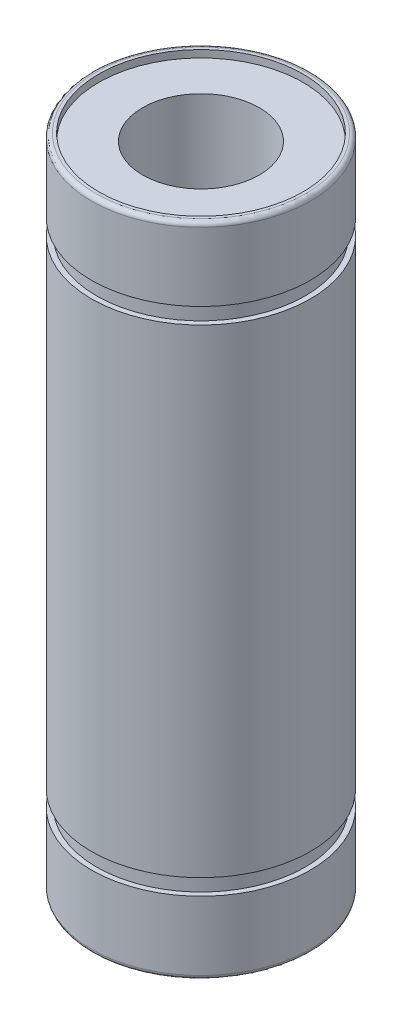
ISO-10303-21;
HEADER;
FILE_DESCRIPTION(('STEP AP214'),'2;1');
FILE_NAME('part.step','',(''),(''),'','','');
FILE_SCHEMA(('AUTOMOTIVE_DESIGN { 1 0 10303 214 1 1 1 1 }'));
ENDSEC;
DATA;
#1=APPLICATION_CONTEXT('core data for automotive mechanical design processes');
#2=APPLICATION_PROTOCOL_DEFINITION('international standard','automotive_design',2000,#1);
#3=PRODUCT_CONTEXT('',#1,'mechanical');
#4=PRODUCT('Part','Part','',(#3));
#5=PRODUCT_RELATED_PRODUCT_CATEGORY('part','',(#4));
#6=PRODUCT_DEFINITION_FORMATION('','',#4);
#7=PRODUCT_DEFINITION_CONTEXT('part definition',#1,'design');
#8=PRODUCT_DEFINITION('design','',#6,#7);
#9=PRODUCT_DEFINITION_SHAPE('','',#8);
#10=(LENGTH_UNIT() NAMED_UNIT(*) SI_UNIT(.MILLI.,.METRE.));
#11=(NAMED_UNIT(*) PLANE_ANGLE_UNIT() SI_UNIT($,.RADIAN.));
#12=(NAMED_UNIT(*) SI_UNIT($,.STERADIAN.) SOLID_ANGLE_UNIT());
#13=UNCERTAINTY_MEASURE_WITH_UNIT(LENGTH_MEASURE(1.E-05),#10,'distance_accuracy_value','');
#14=(GEOMETRIC_REPRESENTATION_CONTEXT(3) GLOBAL_UNCERTAINTY_ASSIGNED_CONTEXT((#13)) GLOBAL_UNIT_ASSIGNED_CONTEXT((#10,
#11,#12)) REPRESENTATION_CONTEXT('',''));
#15=CARTESIAN_POINT('',(0.,0.,0.));
#16=DIRECTION('',(0.,0.,1.));
#17=DIRECTION('',(1.,0.,0.));
#18=AXIS2_PLACEMENT_3D('',#15,#16,#17);
#19=CARTESIAN_POINT('',(0.,22.5,0.));
#20=DIRECTION('',(0.,-1.,0.));
#21=DIRECTION('',(0.,0.,-1.));
#22=AXIS2_PLACEMENT_3D('',#19,#20,#21);
#23=CYLINDRICAL_SURFACE('',#22,4.);
#24=CARTESIAN_POINT('',(0.,22.,0.));
#25=DIRECTION('',(0.,1.,0.));
#26=DIRECTION('',(0.,0.,1.));
#27=AXIS2_PLACEMENT_3D('',#24,#25,#26);
#28=CIRCLE('',#27,4.);
#29=CARTESIAN_POINT('',(0.,22.,4.));
#30=VERTEX_POINT('',#29);
#31=EDGE_CURVE('E41',#30,#30,#28,.T.);
#32=ORIENTED_EDGE('',*,*,#31,.T.);
#33=EDGE_LOOP('',(#32));
#34=FACE_BOUND('',#33,.T.);
#35=CARTESIAN_POINT('',(0.,-22.,0.));
#36=DIRECTION('',(0.,-1.,0.));
#37=DIRECTION('',(0.,0.,-1.));
#38=AXIS2_PLACEMENT_3D('',#35,#36,#37);
#39=CIRCLE('',#38,4.);
#40=CARTESIAN_POINT('',(0.,-22.,-4.));
#41=VERTEX_POINT('',#40);
#42=EDGE_CURVE('E36',#41,#41,#39,.T.);
#43=ORIENTED_EDGE('',*,*,#42,.T.);
#44=EDGE_LOOP('',(#43));
#45=FACE_BOUND('',#44,.T.);
#46=ADVANCED_FACE('F15',(#34,#45),#23,.F.);
#47=CARTESIAN_POINT('',(0.,22.5,0.));
#48=DIRECTION('',(0.,-1.,0.));
#49=DIRECTION('',(0.,0.,-1.));
#50=AXIS2_PLACEMENT_3D('',#47,#48,#49);
#51=CYLINDRICAL_SURFACE('',#50,7.5);
#52=CARTESIAN_POINT('',(0.,-22.2,0.));
#53=DIRECTION('',(0.,1.,0.));
#54=DIRECTION('',(0.,0.,1.));
#55=AXIS2_PLACEMENT_3D('',#52,#53,#54);
#56=CIRCLE('',#55,7.5);
#57=CARTESIAN_POINT('',(0.,-22.2,7.5));
#58=VERTEX_POINT('',#57);
#59=EDGE_CURVE('E30',#58,#58,#56,.T.);
#60=ORIENTED_EDGE('',*,*,#59,.T.);
#61=EDGE_LOOP('',(#60));
#62=FACE_BOUND('',#61,.T.);
#63=CARTESIAN_POINT('',(0.,-17.5,0.));
#64=DIRECTION('',(0.,1.,0.));
#65=DIRECTION('',(0.,0.,1.));
#66=AXIS2_PLACEMENT_3D('',#63,#64,#65);
#67=CIRCLE('',#66,7.5);
#68=CARTESIAN_POINT('',(0.,-17.5,7.5));
#69=VERTEX_POINT('',#68);
#70=EDGE_CURVE('E44',#69,#69,#67,.T.);
#71=ORIENTED_EDGE('',*,*,#70,.F.);
#72=EDGE_LOOP('',(#71));
#73=FACE_BOUND('',#72,.T.);
#74=ADVANCED_FACE('F97',(#62,#73),#51,.T.);
#75=CARTESIAN_POINT('',(0.,-16.4,0.));
#76=DIRECTION('',(0.,1.,0.));
#77=DIRECTION('',(0.,0.,1.));
#78=AXIS2_PLACEMENT_3D('',#75,#76,#77);
#79=CIRCLE('',#78,7.5);
#80=CARTESIAN_POINT('',(0.,-16.4,7.5));
#81=VERTEX_POINT('',#80);
#82=EDGE_CURVE('E63',#81,#81,#79,.T.);
#83=ORIENTED_EDGE('',*,*,#82,.T.);
#84=EDGE_LOOP('',(#83));
#85=FACE_BOUND('',#84,.T.);
#86=CARTESIAN_POINT('',(0.,16.4,0.));
#87=DIRECTION('',(0.,1.,0.));
#88=DIRECTION('',(0.,0.,1.));
#89=AXIS2_PLACEMENT_3D('',#86,#87,#88);
#90=CIRCLE('',#89,7.5);
#91=CARTESIAN_POINT('',(0.,16.4,7.5));
#92=VERTEX_POINT('',#91);
#93=EDGE_CURVE('E35',#92,#92,#90,.T.);
#94=ORIENTED_EDGE('',*,*,#93,.F.);
#95=EDGE_LOOP('',(#94));
#96=FACE_BOUND('',#95,.T.);
#97=ADVANCED_FACE('F104',(#85,#96),#51,.T.);
#98=CARTESIAN_POINT('',(0.,22.5,0.));
#99=DIRECTION('',(0.,1.,0.));
#100=DIRECTION('',(0.,0.,1.));
#101=AXIS2_PLACEMENT_3D('',#98,#99,#100);
#102=PLANE('',#101);
#103=CARTESIAN_POINT('',(0.,22.5,0.));
#104=DIRECTION('',(0.,1.,0.));
#105=DIRECTION('',(0.,0.,1.));
#106=AXIS2_PLACEMENT_3D('',#103,#104,#105);
#107=CIRCLE('',#106,7.2);
#108=CARTESIAN_POINT('',(0.,22.5,7.2));
#109=VERTEX_POINT('',#108);
#110=EDGE_CURVE('E22',#109,#109,#107,.T.);
#111=ORIENTED_EDGE('',*,*,#110,.T.);
#112=EDGE_LOOP('',(#111));
#113=FACE_BOUND('',#112,.T.);
#114=CARTESIAN_POINT('',(0.,22.5,0.));
#115=DIRECTION('',(0.,1.,0.));
#116=DIRECTION('',(0.,0.,1.));
#117=AXIS2_PLACEMENT_3D('',#114,#115,#116);
#118=CIRCLE('',#117,7.);
#119=CARTESIAN_POINT('',(0.,22.5,7.));
#120=VERTEX_POINT('',#119);
#121=EDGE_CURVE('E39',#120,#120,#118,.T.);
#122=ORIENTED_EDGE('',*,*,#121,.F.);
#123=EDGE_LOOP('',(#122));
#124=FACE_BOUND('',#123,.T.);
#125=ADVANCED_FACE('F113',(#113,#124),#102,.T.);
#126=CARTESIAN_POINT('',(0.,-22.5,0.));
#127=DIRECTION('',(0.,1.,0.));
#128=DIRECTION('',(0.,0.,1.));
#129=AXIS2_PLACEMENT_3D('',#126,#127,#128);
#130=PLANE('',#129);
#131=CARTESIAN_POINT('',(0.,-22.5,0.));
#132=DIRECTION('',(0.,1.,0.));
#133=DIRECTION('',(0.,0.,1.));
#134=AXIS2_PLACEMENT_3D('',#131,#132,#133);
#135=CIRCLE('',#134,7.2);
#136=CARTESIAN_POINT('',(0.,-22.5,7.2));
#137=VERTEX_POINT('',#136);
#138=EDGE_CURVE('E26',#137,#137,#135,.F.);
#139=ORIENTED_EDGE('',*,*,#138,.T.);
#140=EDGE_LOOP('',(#139));
#141=FACE_BOUND('',#140,.T.);
#142=CARTESIAN_POINT('',(0.,-22.5,0.));
#143=DIRECTION('',(0.,1.,0.));
#144=DIRECTION('',(0.,0.,1.));
#145=AXIS2_PLACEMENT_3D('',#142,#143,#144);
#146=CIRCLE('',#145,7.);
#147=CARTESIAN_POINT('',(0.,-22.5,7.));
#148=VERTEX_POINT('',#147);
#149=EDGE_CURVE('E72',#148,#148,#146,.T.);
#150=ORIENTED_EDGE('',*,*,#149,.T.);
#151=EDGE_LOOP('',(#150));
#152=FACE_BOUND('',#151,.T.);
#153=ADVANCED_FACE('F116',(#141,#152),#130,.F.);
#154=CARTESIAN_POINT('',(0.,22.2,0.));
#155=DIRECTION('',(0.,1.,0.));
#156=DIRECTION('',(0.,0.,1.));
#157=AXIS2_PLACEMENT_3D('',#154,#155,#156);
#158=CIRCLE('',#157,7.5);
#159=CARTESIAN_POINT('',(0.,22.2,7.5));
#160=VERTEX_POINT('',#159);
#161=EDGE_CURVE('E10',#160,#160,#158,.F.);
#162=ORIENTED_EDGE('',*,*,#161,.T.);
#163=EDGE_LOOP('',(#162));
#164=FACE_BOUND('',#163,.T.);
#165=CARTESIAN_POINT('',(0.,17.5,0.));
#166=DIRECTION('',(0.,1.,0.));
#167=DIRECTION('',(0.,0.,1.));
#168=AXIS2_PLACEMENT_3D('',#165,#166,#167);
#169=CIRCLE('',#168,7.5);
#170=CARTESIAN_POINT('',(0.,17.5,7.5));
#171=VERTEX_POINT('',#170);
#172=EDGE_CURVE('E54',#171,#171,#169,.T.);
#173=ORIENTED_EDGE('',*,*,#172,.T.);
#174=EDGE_LOOP('',(#173));
#175=FACE_BOUND('',#174,.T.);
#176=ADVANCED_FACE('F107',(#164,#175),#51,.T.);
#177=CARTESIAN_POINT('',(-7.5,16.4,0.));
#178=DIRECTION('',(0.,-1.,0.));
#179=DIRECTION('',(0.,0.,-1.));
#180=AXIS2_PLACEMENT_3D('',#177,#178,#179);
#181=PLANE('',#180);
#182=CARTESIAN_POINT('',(0.,16.4,0.));
#183=DIRECTION('',(0.,1.,0.));
#184=DIRECTION('',(0.,0.,1.));
#185=AXIS2_PLACEMENT_3D('',#182,#183,#184);
#186=CIRCLE('',#185,7.15);
#187=CARTESIAN_POINT('',(0.,16.4,7.15));
#188=VERTEX_POINT('',#187);
#189=EDGE_CURVE('E48',#188,#188,#186,.T.);
#190=ORIENTED_EDGE('',*,*,#189,.F.);
#191=EDGE_LOOP('',(#190));
#192=FACE_BOUND('',#191,.T.);
#193=ORIENTED_EDGE('',*,*,#93,.T.);
#194=EDGE_LOOP('',(#193));
#195=FACE_BOUND('',#194,.T.);
#196=ADVANCED_FACE('F111',(#192,#195),#181,.F.);
#197=CARTESIAN_POINT('',(0.,30.4919005746849,0.));
#198=DIRECTION('',(0.,1.,0.));
#199=DIRECTION('',(0.,0.,1.));
#200=AXIS2_PLACEMENT_3D('',#197,#198,#199);
#201=CYLINDRICAL_SURFACE('',#200,7.15);
#202=CARTESIAN_POINT('',(0.,17.5,0.));
#203=DIRECTION('',(0.,1.,0.));
#204=DIRECTION('',(0.,0.,1.));
#205=AXIS2_PLACEMENT_3D('',#202,#203,#204);
#206=CIRCLE('',#205,7.15);
#207=CARTESIAN_POINT('',(0.,17.5,7.15));
#208=VERTEX_POINT('',#207);
#209=EDGE_CURVE('E51',#208,#208,#206,.T.);
#210=ORIENTED_EDGE('',*,*,#209,.F.);
#211=EDGE_LOOP('',(#210));
#212=FACE_BOUND('',#211,.T.);
#213=ORIENTED_EDGE('',*,*,#189,.T.);
#214=EDGE_LOOP('',(#213));
#215=FACE_BOUND('',#214,.T.);
#216=ADVANCED_FACE('F124',(#212,#215),#201,.T.);
#217=CARTESIAN_POINT('',(-7.5,17.5,0.));
#218=DIRECTION('',(0.,1.,0.));
#219=DIRECTION('',(0.,0.,1.));
#220=AXIS2_PLACEMENT_3D('',#217,#218,#219);
#221=PLANE('',#220);
#222=ORIENTED_EDGE('',*,*,#172,.F.);
#223=EDGE_LOOP('',(#222));
#224=FACE_BOUND('',#223,.T.);
#225=ORIENTED_EDGE('',*,*,#209,.T.);
#226=EDGE_LOOP('',(#225));
#227=FACE_BOUND('',#226,.T.);
#228=ADVANCED_FACE('F153',(#224,#227),#221,.F.);
#229=CARTESIAN_POINT('',(-7.5,-17.5,0.));
#230=DIRECTION('',(0.,-1.,0.));
#231=DIRECTION('',(0.,0.,-1.));
#232=AXIS2_PLACEMENT_3D('',#229,#230,#231);
#233=PLANE('',#232);
#234=CARTESIAN_POINT('',(0.,-17.5,0.));
#235=DIRECTION('',(0.,1.,0.));
#236=DIRECTION('',(0.,0.,1.));
#237=AXIS2_PLACEMENT_3D('',#234,#235,#236);
#238=CIRCLE('',#237,7.15);
#239=CARTESIAN_POINT('',(0.,-17.5,7.15));
#240=VERTEX_POINT('',#239);
#241=EDGE_CURVE('E57',#240,#240,#238,.T.);
#242=ORIENTED_EDGE('',*,*,#241,.F.);
#243=EDGE_LOOP('',(#242));
#244=FACE_BOUND('',#243,.T.);
#245=ORIENTED_EDGE('',*,*,#70,.T.);
#246=EDGE_LOOP('',(#245));
#247=FACE_BOUND('',#246,.T.);
#248=ADVANCED_FACE('F147',(#244,#247),#233,.F.);
#249=CARTESIAN_POINT('',(0.,30.4919005746849,0.));
#250=DIRECTION('',(0.,1.,0.));
#251=DIRECTION('',(0.,0.,1.));
#252=AXIS2_PLACEMENT_3D('',#249,#250,#251);
#253=CYLINDRICAL_SURFACE('',#252,7.15);
#254=CARTESIAN_POINT('',(0.,-16.4,0.));
#255=DIRECTION('',(0.,1.,0.));
#256=DIRECTION('',(0.,0.,1.));
#257=AXIS2_PLACEMENT_3D('',#254,#255,#256);
#258=CIRCLE('',#257,7.15);
#259=CARTESIAN_POINT('',(0.,-16.4,7.15));
#260=VERTEX_POINT('',#259);
#261=EDGE_CURVE('E60',#260,#260,#258,.T.);
#262=ORIENTED_EDGE('',*,*,#261,.F.);
#263=EDGE_LOOP('',(#262));
#264=FACE_BOUND('',#263,.T.);
#265=ORIENTED_EDGE('',*,*,#241,.T.);
#266=EDGE_LOOP('',(#265));
#267=FACE_BOUND('',#266,.T.);
#268=ADVANCED_FACE('F141',(#264,#267),#253,.T.);
#269=CARTESIAN_POINT('',(-7.5,-16.4,0.));
#270=DIRECTION('',(0.,1.,0.));
#271=DIRECTION('',(0.,0.,1.));
#272=AXIS2_PLACEMENT_3D('',#269,#270,#271);
#273=PLANE('',#272);
#274=ORIENTED_EDGE('',*,*,#82,.F.);
#275=EDGE_LOOP('',(#274));
#276=FACE_BOUND('',#275,.T.);
#277=ORIENTED_EDGE('',*,*,#261,.T.);
#278=EDGE_LOOP('',(#277));
#279=FACE_BOUND('',#278,.T.);
#280=ADVANCED_FACE('F137',(#276,#279),#273,.F.);
#281=CARTESIAN_POINT('',(0.,22.,0.));
#282=DIRECTION('',(0.,1.,0.));
#283=DIRECTION('',(0.,0.,1.));
#284=AXIS2_PLACEMENT_3D('',#281,#282,#283);
#285=CYLINDRICAL_SURFACE('',#284,7.);
#286=CARTESIAN_POINT('',(0.,22.,0.));
#287=DIRECTION('',(0.,1.,0.));
#288=DIRECTION('',(0.,0.,1.));
#289=AXIS2_PLACEMENT_3D('',#286,#287,#288);
#290=CIRCLE('',#289,7.);
#291=CARTESIAN_POINT('',(0.,22.,7.));
#292=VERTEX_POINT('',#291);
#293=EDGE_CURVE('E45',#292,#292,#290,.T.);
#294=ORIENTED_EDGE('',*,*,#293,.F.);
#295=EDGE_LOOP('',(#294));
#296=FACE_BOUND('',#295,.T.);
#297=ORIENTED_EDGE('',*,*,#121,.T.);
#298=EDGE_LOOP('',(#297));
#299=FACE_BOUND('',#298,.T.);
#300=ADVANCED_FACE('F140',(#296,#299),#285,.F.);
#301=CARTESIAN_POINT('',(0.,22.,0.));
#302=DIRECTION('',(0.,1.,0.));
#303=DIRECTION('',(0.,0.,1.));
#304=AXIS2_PLACEMENT_3D('',#301,#302,#303);
#305=PLANE('',#304);
#306=ORIENTED_EDGE('',*,*,#31,.F.);
#307=EDGE_LOOP('',(#306));
#308=FACE_BOUND('',#307,.T.);
#309=ORIENTED_EDGE('',*,*,#293,.T.);
#310=EDGE_LOOP('',(#309));
#311=FACE_BOUND('',#310,.T.);
#312=ADVANCED_FACE('F93',(#308,#311),#305,.T.);
#313=CARTESIAN_POINT('',(0.,-22.,0.));
#314=DIRECTION('',(0.,-1.,0.));
#315=DIRECTION('',(0.,0.,-1.));
#316=AXIS2_PLACEMENT_3D('',#313,#314,#315);
#317=CYLINDRICAL_SURFACE('',#316,7.);
#318=CARTESIAN_POINT('',(0.,-22.,0.));
#319=DIRECTION('',(0.,1.,0.));
#320=DIRECTION('',(0.,0.,1.));
#321=AXIS2_PLACEMENT_3D('',#318,#319,#320);
#322=CIRCLE('',#321,7.);
#323=CARTESIAN_POINT('',(0.,-22.,7.));
#324=VERTEX_POINT('',#323);
#325=EDGE_CURVE('E40',#324,#324,#322,.T.);
#326=ORIENTED_EDGE('',*,*,#325,.T.);
#327=EDGE_LOOP('',(#326));
#328=FACE_BOUND('',#327,.T.);
#329=ORIENTED_EDGE('',*,*,#149,.F.);
#330=EDGE_LOOP('',(#329));
#331=FACE_BOUND('',#330,.T.);
#332=ADVANCED_FACE('F78',(#328,#331),#317,.F.);
#333=CARTESIAN_POINT('',(0.,-22.,0.));
#334=DIRECTION('',(0.,-1.,0.));
#335=DIRECTION('',(0.,0.,1.));
#336=AXIS2_PLACEMENT_3D('',#333,#334,#335);
#337=PLANE('',#336);
#338=ORIENTED_EDGE('',*,*,#42,.F.);
#339=EDGE_LOOP('',(#338));
#340=FACE_BOUND('',#339,.T.);
#341=ORIENTED_EDGE('',*,*,#325,.F.);
#342=EDGE_LOOP('',(#341));
#343=FACE_BOUND('',#342,.T.);
#344=ADVANCED_FACE('F81',(#340,#343),#337,.T.);
#345=CARTESIAN_POINT('',(0.,-22.2,0.));
#346=DIRECTION('',(0.,1.,0.));
#347=DIRECTION('',(0.,0.,1.));
#348=AXIS2_PLACEMENT_3D('',#345,#346,#347);
#349=TOROIDAL_SURFACE('',#348,7.2,0.3);
#350=ORIENTED_EDGE('',*,*,#138,.F.);
#351=EDGE_LOOP('',(#350));
#352=FACE_BOUND('',#351,.T.);
#353=ORIENTED_EDGE('',*,*,#59,.F.);
#354=EDGE_LOOP('',(#353));
#355=FACE_BOUND('',#354,.T.);
#356=ADVANCED_FACE('F83',(#352,#355),#349,.T.);
#357=CARTESIAN_POINT('',(0.,22.2,0.));
#358=DIRECTION('',(0.,1.,0.));
#359=DIRECTION('',(0.,0.,1.));
#360=AXIS2_PLACEMENT_3D('',#357,#358,#359);
#361=TOROIDAL_SURFACE('',#360,7.2,0.3);
#362=ORIENTED_EDGE('',*,*,#161,.F.);
#363=EDGE_LOOP('',(#362));
#364=FACE_BOUND('',#363,.T.);
#365=ORIENTED_EDGE('',*,*,#110,.F.);
#366=EDGE_LOOP('',(#365));
#367=FACE_BOUND('',#366,.T.);
#368=ADVANCED_FACE('F17',(#364,#367),#361,.T.);
#369=CLOSED_SHELL('',(#46,#74,#97,#125,#153,#176,#196,#216,#228,#248,#268,#280,#300,#312,#332,
#344,#356,#368));
#370=MANIFOLD_SOLID_BREP('B1',#369);
#371=ADVANCED_BREP_SHAPE_REPRESENTATION('',(#18,#370),#14);
#372=SHAPE_DEFINITION_REPRESENTATION(#9,#371);
ENDSEC;
END-ISO-10303-21;
